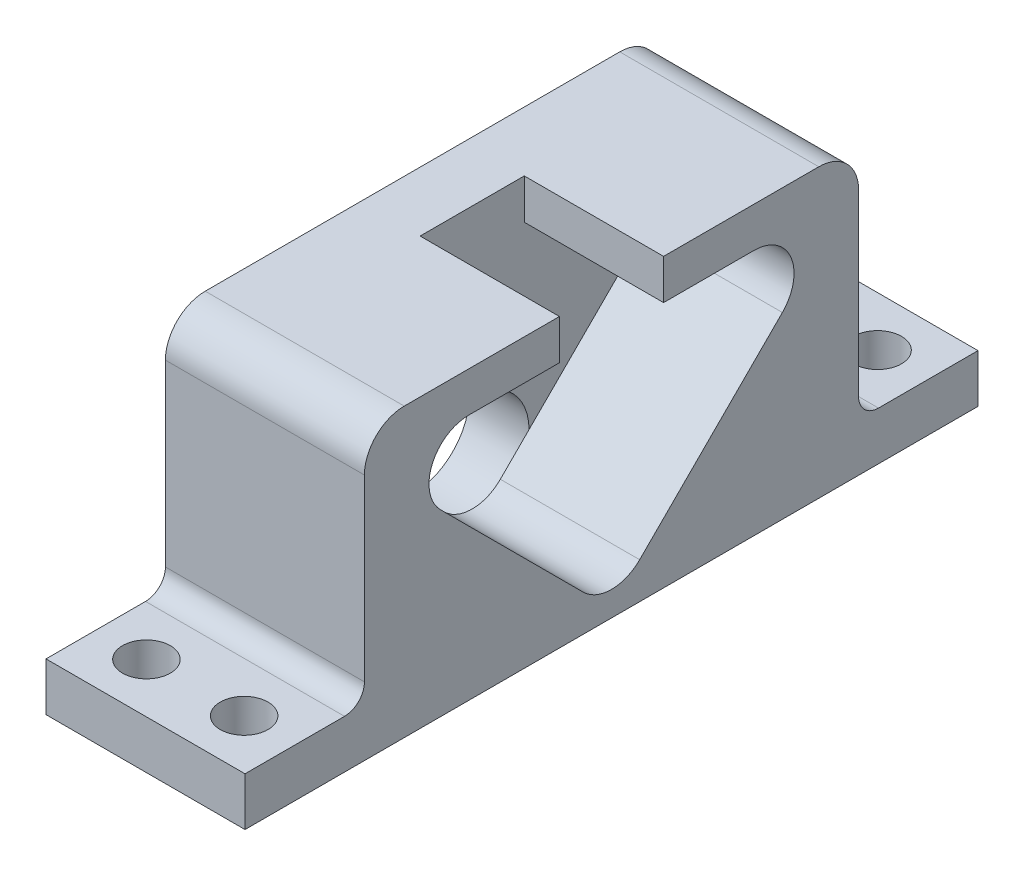
ISO-10303-21;
HEADER;
FILE_DESCRIPTION(('STEP AP214'),'2;1');
FILE_NAME('part.step','',(''),(''),'','','');
FILE_SCHEMA(('AUTOMOTIVE_DESIGN { 1 0 10303 214 1 1 1 1 }'));
ENDSEC;
DATA;
#1=APPLICATION_CONTEXT('core data for automotive mechanical design processes');
#2=APPLICATION_PROTOCOL_DEFINITION('international standard','automotive_design',2000,#1);
#3=PRODUCT_CONTEXT('',#1,'mechanical');
#4=PRODUCT('Part','Part','',(#3));
#5=PRODUCT_RELATED_PRODUCT_CATEGORY('part','',(#4));
#6=PRODUCT_DEFINITION_FORMATION('','',#4);
#7=PRODUCT_DEFINITION_CONTEXT('part definition',#1,'design');
#8=PRODUCT_DEFINITION('design','',#6,#7);
#9=PRODUCT_DEFINITION_SHAPE('','',#8);
#10=(LENGTH_UNIT() NAMED_UNIT(*) SI_UNIT(.MILLI.,.METRE.));
#11=(NAMED_UNIT(*) PLANE_ANGLE_UNIT() SI_UNIT($,.RADIAN.));
#12=(NAMED_UNIT(*) SI_UNIT($,.STERADIAN.) SOLID_ANGLE_UNIT());
#13=UNCERTAINTY_MEASURE_WITH_UNIT(LENGTH_MEASURE(1.E-05),#10,'distance_accuracy_value','');
#14=(GEOMETRIC_REPRESENTATION_CONTEXT(3) GLOBAL_UNCERTAINTY_ASSIGNED_CONTEXT((#13)) GLOBAL_UNIT_ASSIGNED_CONTEXT((#10,
#11,#12)) REPRESENTATION_CONTEXT('',''));
#15=CARTESIAN_POINT('',(0.,0.,0.));
#16=DIRECTION('',(0.,0.,1.));
#17=DIRECTION('',(1.,0.,0.));
#18=AXIS2_PLACEMENT_3D('',#15,#16,#17);
#19=CARTESIAN_POINT('',(-4.20165922888838,21.6997914847848,-15.));
#20=DIRECTION('',(0.,1.,0.));
#21=DIRECTION('',(0.,0.,1.));
#22=AXIS2_PLACEMENT_3D('',#19,#20,#21);
#23=PLANE('',#22);
#24=DIRECTION('',(0.,0.,1.));
#25=VECTOR('',#24,1.);
#26=CARTESIAN_POINT('',(-4.20165922888838,21.6997914847848,-15.));
#27=LINE('',#26,#25);
#28=CARTESIAN_POINT('',(-4.20165922888838,21.6997914847848,3.27077305544387));
#29=VERTEX_POINT('',#28);
#30=CARTESIAN_POINT('',(-4.20165922888838,21.6997914847848,8.96446609406725));
#31=VERTEX_POINT('',#30);
#32=EDGE_CURVE('E364',#29,#31,#27,.T.);
#33=ORIENTED_EDGE('',*,*,#32,.F.);
#34=DIRECTION('',(-1.,0.,0.));
#35=VECTOR('',#34,1.);
#36=CARTESIAN_POINT('',(4.54834077111162,21.6997914847848,3.27077305544387));
#37=LINE('',#36,#35);
#38=CARTESIAN_POINT('',(4.54834077111162,21.6997914847848,3.27077305544387));
#39=VERTEX_POINT('',#38);
#40=EDGE_CURVE('E380',#39,#29,#37,.T.);
#41=ORIENTED_EDGE('',*,*,#40,.F.);
#42=DIRECTION('',(0.,0.,1.));
#43=VECTOR('',#42,1.);
#44=CARTESIAN_POINT('',(4.54834077111162,21.6997914847848,-15.));
#45=LINE('',#44,#43);
#46=CARTESIAN_POINT('',(4.54834077111162,21.6997914847848,8.96446609406725));
#47=VERTEX_POINT('',#46);
#48=EDGE_CURVE('E371',#39,#47,#45,.T.);
#49=ORIENTED_EDGE('',*,*,#48,.T.);
#50=DIRECTION('',(1.,0.,0.));
#51=VECTOR('',#50,1.);
#52=CARTESIAN_POINT('',(-4.20165922888838,21.6997914847848,8.96446609406725));
#53=LINE('',#52,#51);
#54=EDGE_CURVE('E288',#47,#31,#53,.F.);
#55=ORIENTED_EDGE('',*,*,#54,.T.);
#56=EDGE_LOOP('',(#33,#41,#49,#55));
#57=FACE_BOUND('',#56,.T.);
#58=ADVANCED_FACE('F35',(#57),#23,.F.);
#59=CARTESIAN_POINT('',(4.54834077111162,9.21637163704683,-15.5177669529664));
#60=DIRECTION('',(0.,0.,1.));
#61=DIRECTION('',(0.,-1.,0.));
#62=AXIS2_PLACEMENT_3D('',#59,#60,#61);
#63=PLANE('',#62);
#64=DIRECTION('',(0.,1.,0.));
#65=VECTOR('',#64,1.);
#66=CARTESIAN_POINT('',(4.54834077111162,9.21637163704683,-15.5177669529664));
#67=LINE('',#66,#65);
#68=CARTESIAN_POINT('',(4.54834077111162,10.4663716370468,-15.5177669529664));
#69=VERTEX_POINT('',#68);
#70=CARTESIAN_POINT('',(4.54834077111162,21.7163716370468,-15.5177669529664));
#71=VERTEX_POINT('',#70);
#72=EDGE_CURVE('E225',#69,#71,#67,.T.);
#73=ORIENTED_EDGE('',*,*,#72,.F.);
#74=DIRECTION('',(-1.,0.,0.));
#75=VECTOR('',#74,1.);
#76=CARTESIAN_POINT('',(-7.95165922888838,10.4663716370468,-15.5177669529664));
#77=LINE('',#76,#75);
#78=CARTESIAN_POINT('',(-7.95165922888838,10.4663716370468,-15.5177669529664));
#79=VERTEX_POINT('',#78);
#80=EDGE_CURVE('E320',#69,#79,#77,.T.);
#81=ORIENTED_EDGE('',*,*,#80,.T.);
#82=DIRECTION('',(0.,1.,0.));
#83=VECTOR('',#82,1.);
#84=CARTESIAN_POINT('',(-7.95165922888838,9.21637163704683,-15.5177669529664));
#85=LINE('',#84,#83);
#86=CARTESIAN_POINT('',(-7.95165922888838,21.7163716370468,-15.5177669529664));
#87=VERTEX_POINT('',#86);
#88=EDGE_CURVE('E240',#79,#87,#85,.T.);
#89=ORIENTED_EDGE('',*,*,#88,.T.);
#90=DIRECTION('',(-1.,0.,0.));
#91=VECTOR('',#90,1.);
#92=CARTESIAN_POINT('',(4.54834077111162,21.7163716370468,-15.5177669529664));
#93=LINE('',#92,#91);
#94=EDGE_CURVE('E311',#87,#71,#93,.F.);
#95=ORIENTED_EDGE('',*,*,#94,.T.);
#96=EDGE_LOOP('',(#73,#81,#89,#95));
#97=FACE_BOUND('',#96,.T.);
#98=ADVANCED_FACE('F463',(#97),#63,.F.);
#99=CARTESIAN_POINT('',(4.54834077111162,24.2163716370468,-15.5177669529664));
#100=DIRECTION('',(0.,-1.,0.));
#101=DIRECTION('',(0.,0.,-1.));
#102=AXIS2_PLACEMENT_3D('',#99,#100,#101);
#103=PLANE('',#102);
#104=DIRECTION('',(0.,0.,1.));
#105=VECTOR('',#104,1.);
#106=CARTESIAN_POINT('',(4.54834077111162,24.2163716370468,-15.5177669529664));
#107=LINE('',#106,#105);
#108=CARTESIAN_POINT('',(4.54834077111162,24.2163716370468,3.27077305544387));
#109=VERTEX_POINT('',#108);
#110=CARTESIAN_POINT('',(4.54834077111162,24.2163716370468,13.0177669529664));
#111=VERTEX_POINT('',#110);
#112=EDGE_CURVE('E220',#109,#111,#107,.T.);
#113=ORIENTED_EDGE('',*,*,#112,.F.);
#114=DIRECTION('',(1.,0.,0.));
#115=VECTOR('',#114,1.);
#116=CARTESIAN_POINT('',(4.54834077111162,24.2163716370468,3.27077305544387));
#117=LINE('',#116,#115);
#118=CARTESIAN_POINT('',(-4.20165922888838,24.2163716370468,3.27077305544387));
#119=VERTEX_POINT('',#118);
#120=EDGE_CURVE('E203',#119,#109,#117,.T.);
#121=ORIENTED_EDGE('',*,*,#120,.F.);
#122=DIRECTION('',(0.,0.,1.));
#123=VECTOR('',#122,1.);
#124=CARTESIAN_POINT('',(-4.20165922888838,24.2163716370468,-3.27077305544388));
#125=LINE('',#124,#123);
#126=CARTESIAN_POINT('',(-4.20165922888838,24.2163716370468,-3.27077305544388));
#127=VERTEX_POINT('',#126);
#128=EDGE_CURVE('E213',#127,#119,#125,.T.);
#129=ORIENTED_EDGE('',*,*,#128,.F.);
#130=DIRECTION('',(-1.,0.,0.));
#131=VECTOR('',#130,1.);
#132=CARTESIAN_POINT('',(4.54834077111162,24.2163716370468,-3.27077305544388));
#133=LINE('',#132,#131);
#134=CARTESIAN_POINT('',(4.54834077111162,24.2163716370468,-3.27077305544388));
#135=VERTEX_POINT('',#134);
#136=EDGE_CURVE('E194',#135,#127,#133,.T.);
#137=ORIENTED_EDGE('',*,*,#136,.F.);
#138=CARTESIAN_POINT('',(4.54834077111162,24.2163716370468,-13.0177669529664));
#139=VERTEX_POINT('',#138);
#140=EDGE_CURVE('E210',#139,#135,#107,.T.);
#141=ORIENTED_EDGE('',*,*,#140,.F.);
#142=DIRECTION('',(-1.,0.,0.));
#143=VECTOR('',#142,1.);
#144=CARTESIAN_POINT('',(4.54834077111162,24.2163716370468,-13.0177669529664));
#145=LINE('',#144,#143);
#146=CARTESIAN_POINT('',(-7.95165922888838,24.2163716370468,-13.0177669529664));
#147=VERTEX_POINT('',#146);
#148=EDGE_CURVE('E304',#139,#147,#145,.T.);
#149=ORIENTED_EDGE('',*,*,#148,.T.);
#150=DIRECTION('',(0.,0.,1.));
#151=VECTOR('',#150,1.);
#152=CARTESIAN_POINT('',(-7.95165922888838,24.2163716370468,-15.5177669529664));
#153=LINE('',#152,#151);
#154=CARTESIAN_POINT('',(-7.95165922888838,24.2163716370468,13.0177669529664));
#155=VERTEX_POINT('',#154);
#156=EDGE_CURVE('E242',#147,#155,#153,.T.);
#157=ORIENTED_EDGE('',*,*,#156,.T.);
#158=DIRECTION('',(-1.,0.,0.));
#159=VECTOR('',#158,1.);
#160=CARTESIAN_POINT('',(4.54834077111162,24.2163716370468,13.0177669529664));
#161=LINE('',#160,#159);
#162=EDGE_CURVE('E301',#155,#111,#161,.F.);
#163=ORIENTED_EDGE('',*,*,#162,.T.);
#164=EDGE_LOOP('',(#113,#121,#129,#137,#141,#149,#157,#163));
#165=FACE_BOUND('',#164,.T.);
#166=ADVANCED_FACE('F208',(#165),#103,.F.);
#167=CARTESIAN_POINT('',(4.54834077111162,24.2163716370468,15.5177669529664));
#168=DIRECTION('',(0.,0.,-1.));
#169=DIRECTION('',(-1.,0.,0.));
#170=AXIS2_PLACEMENT_3D('',#167,#168,#169);
#171=PLANE('',#170);
#172=DIRECTION('',(0.,-1.,0.));
#173=VECTOR('',#172,1.);
#174=CARTESIAN_POINT('',(-7.95165922888838,24.2163716370468,15.5177669529664));
#175=LINE('',#174,#173);
#176=CARTESIAN_POINT('',(-7.95165922888838,21.7163716370468,15.5177669529664));
#177=VERTEX_POINT('',#176);
#178=CARTESIAN_POINT('',(-7.95165922888838,10.4663716370468,15.5177669529664));
#179=VERTEX_POINT('',#178);
#180=EDGE_CURVE('E246',#177,#179,#175,.T.);
#181=ORIENTED_EDGE('',*,*,#180,.T.);
#182=DIRECTION('',(-1.,0.,0.));
#183=VECTOR('',#182,1.);
#184=CARTESIAN_POINT('',(4.54834077111162,10.4663716370468,15.5177669529664));
#185=LINE('',#184,#183);
#186=CARTESIAN_POINT('',(4.54834077111162,10.4663716370468,15.5177669529664));
#187=VERTEX_POINT('',#186);
#188=EDGE_CURVE('E328',#179,#187,#185,.F.);
#189=ORIENTED_EDGE('',*,*,#188,.T.);
#190=DIRECTION('',(0.,-1.,0.));
#191=VECTOR('',#190,1.);
#192=CARTESIAN_POINT('',(4.54834077111162,24.2163716370468,15.5177669529664));
#193=LINE('',#192,#191);
#194=CARTESIAN_POINT('',(4.54834077111162,21.7163716370468,15.5177669529664));
#195=VERTEX_POINT('',#194);
#196=EDGE_CURVE('E219',#195,#187,#193,.T.);
#197=ORIENTED_EDGE('',*,*,#196,.F.);
#198=DIRECTION('',(-1.,0.,0.));
#199=VECTOR('',#198,1.);
#200=CARTESIAN_POINT('',(4.54834077111162,21.7163716370468,15.5177669529664));
#201=LINE('',#200,#199);
#202=EDGE_CURVE('E317',#195,#177,#201,.T.);
#203=ORIENTED_EDGE('',*,*,#202,.T.);
#204=EDGE_LOOP('',(#181,#189,#197,#203));
#205=FACE_BOUND('',#204,.T.);
#206=ADVANCED_FACE('F437',(#205),#171,.F.);
#207=CARTESIAN_POINT('',(4.54834077111162,9.21637163704683,15.5177669529664));
#208=DIRECTION('',(0.,-1.,0.));
#209=DIRECTION('',(0.,0.,-1.));
#210=AXIS2_PLACEMENT_3D('',#207,#208,#209);
#211=PLANE('',#210);
#212=CARTESIAN_POINT('',(1.36662188836983,9.21637163704683,19.8927669529664));
#213=DIRECTION('',(0.,1.,0.));
#214=DIRECTION('',(0.,0.,-1.));
#215=AXIS2_PLACEMENT_3D('',#212,#213,#214);
#216=CIRCLE('',#215,1.5);
#217=CARTESIAN_POINT('',(1.36662188836983,9.21637163704683,18.3927669529664));
#218=VERTEX_POINT('',#217);
#219=EDGE_CURVE('E347',#218,#218,#216,.T.);
#220=ORIENTED_EDGE('',*,*,#219,.F.);
#221=EDGE_LOOP('',(#220));
#222=FACE_BOUND('',#221,.T.);
#223=CARTESIAN_POINT('',(-4.76994034614659,9.21637163704683,19.8927669529664));
#224=DIRECTION('',(0.,1.,0.));
#225=DIRECTION('',(0.,0.,1.));
#226=AXIS2_PLACEMENT_3D('',#223,#224,#225);
#227=CIRCLE('',#226,1.5);
#228=CARTESIAN_POINT('',(-4.76994034614659,9.21637163704683,21.3927669529664));
#229=VERTEX_POINT('',#228);
#230=EDGE_CURVE('E337',#229,#229,#227,.T.);
#231=ORIENTED_EDGE('',*,*,#230,.F.);
#232=EDGE_LOOP('',(#231));
#233=FACE_BOUND('',#232,.T.);
#234=DIRECTION('',(0.,0.,1.));
#235=VECTOR('',#234,1.);
#236=CARTESIAN_POINT('',(4.54834077111162,9.21637163704683,15.5177669529664));
#237=LINE('',#236,#235);
#238=CARTESIAN_POINT('',(4.54834077111162,9.21637163704683,16.7677669529664));
#239=VERTEX_POINT('',#238);
#240=CARTESIAN_POINT('',(4.54834077111162,9.21637163704683,23.0177669529664));
#241=VERTEX_POINT('',#240);
#242=EDGE_CURVE('E223',#239,#241,#237,.T.);
#243=ORIENTED_EDGE('',*,*,#242,.F.);
#244=DIRECTION('',(-1.,0.,0.));
#245=VECTOR('',#244,1.);
#246=CARTESIAN_POINT('',(-7.95165922888838,9.21637163704683,16.7677669529664));
#247=LINE('',#246,#245);
#248=CARTESIAN_POINT('',(-7.95165922888838,9.21637163704683,16.7677669529664));
#249=VERTEX_POINT('',#248);
#250=EDGE_CURVE('E325',#239,#249,#247,.T.);
#251=ORIENTED_EDGE('',*,*,#250,.T.);
#252=DIRECTION('',(0.,0.,1.));
#253=VECTOR('',#252,1.);
#254=CARTESIAN_POINT('',(-7.95165922888838,9.21637163704683,15.5177669529664));
#255=LINE('',#254,#253);
#256=CARTESIAN_POINT('',(-7.95165922888838,9.21637163704683,23.0177669529664));
#257=VERTEX_POINT('',#256);
#258=EDGE_CURVE('E248',#249,#257,#255,.T.);
#259=ORIENTED_EDGE('',*,*,#258,.T.);
#260=DIRECTION('',(-1.,0.,0.));
#261=VECTOR('',#260,1.);
#262=CARTESIAN_POINT('',(4.54834077111162,9.21637163704683,23.0177669529664));
#263=LINE('',#262,#261);
#264=EDGE_CURVE('E267',#241,#257,#263,.T.);
#265=ORIENTED_EDGE('',*,*,#264,.F.);
#266=EDGE_LOOP('',(#243,#251,#259,#265));
#267=FACE_BOUND('',#266,.T.);
#268=ADVANCED_FACE('F433',(#222,#233,#267),#211,.F.);
#269=CARTESIAN_POINT('',(4.54834077111162,9.21637163704683,23.0177669529664));
#270=DIRECTION('',(0.,0.,-1.));
#271=DIRECTION('',(-1.,0.,0.));
#272=AXIS2_PLACEMENT_3D('',#269,#270,#271);
#273=PLANE('',#272);
#274=DIRECTION('',(0.,-1.,0.));
#275=VECTOR('',#274,1.);
#276=CARTESIAN_POINT('',(-7.95165922888838,9.21637163704683,23.0177669529664));
#277=LINE('',#276,#275);
#278=CARTESIAN_POINT('',(-7.95165922888838,6.18231268137411,23.0177669529664));
#279=VERTEX_POINT('',#278);
#280=EDGE_CURVE('E250',#257,#279,#277,.T.);
#281=ORIENTED_EDGE('',*,*,#280,.T.);
#282=DIRECTION('',(-1.,0.,0.));
#283=VECTOR('',#282,1.);
#284=CARTESIAN_POINT('',(4.54834077111162,6.18231268137411,23.0177669529664));
#285=LINE('',#284,#283);
#286=CARTESIAN_POINT('',(4.54834077111162,6.18231268137411,23.0177669529664));
#287=VERTEX_POINT('',#286);
#288=EDGE_CURVE('E264',#287,#279,#285,.T.);
#289=ORIENTED_EDGE('',*,*,#288,.F.);
#290=DIRECTION('',(0.,-1.,0.));
#291=VECTOR('',#290,1.);
#292=CARTESIAN_POINT('',(4.54834077111162,9.21637163704683,23.0177669529664));
#293=LINE('',#292,#291);
#294=EDGE_CURVE('E230',#241,#287,#293,.T.);
#295=ORIENTED_EDGE('',*,*,#294,.F.);
#296=ORIENTED_EDGE('',*,*,#264,.T.);
#297=EDGE_LOOP('',(#281,#289,#295,#296));
#298=FACE_BOUND('',#297,.T.);
#299=ADVANCED_FACE('F436',(#298),#273,.F.);
#300=CARTESIAN_POINT('',(4.54834077111162,6.18231268137411,23.0177669529664));
#301=DIRECTION('',(0.,1.,0.));
#302=DIRECTION('',(0.,0.,1.));
#303=AXIS2_PLACEMENT_3D('',#300,#301,#302);
#304=PLANE('',#303);
#305=CARTESIAN_POINT('',(1.36662188836983,6.18231268137411,-19.8927669529664));
#306=DIRECTION('',(0.,1.,0.));
#307=DIRECTION('',(0.,0.,1.));
#308=AXIS2_PLACEMENT_3D('',#305,#306,#307);
#309=CIRCLE('',#308,1.5);
#310=CARTESIAN_POINT('',(1.36662188836983,6.18231268137411,-18.3927669529664));
#311=VERTEX_POINT('',#310);
#312=EDGE_CURVE('E413',#311,#311,#309,.F.);
#313=ORIENTED_EDGE('',*,*,#312,.F.);
#314=EDGE_LOOP('',(#313));
#315=FACE_BOUND('',#314,.T.);
#316=CARTESIAN_POINT('',(-4.76994034614659,6.18231268137411,-19.8927669529664));
#317=DIRECTION('',(0.,1.,0.));
#318=DIRECTION('',(0.,0.,1.));
#319=AXIS2_PLACEMENT_3D('',#316,#317,#318);
#320=CIRCLE('',#319,1.5);
#321=CARTESIAN_POINT('',(-4.76994034614659,6.18231268137411,-18.3927669529664));
#322=VERTEX_POINT('',#321);
#323=EDGE_CURVE('E423',#322,#322,#320,.F.);
#324=ORIENTED_EDGE('',*,*,#323,.F.);
#325=EDGE_LOOP('',(#324));
#326=FACE_BOUND('',#325,.T.);
#327=CARTESIAN_POINT('',(1.36662188836983,6.18231268137411,19.8927669529664));
#328=DIRECTION('',(0.,1.,0.));
#329=DIRECTION('',(0.,0.,1.));
#330=AXIS2_PLACEMENT_3D('',#327,#328,#329);
#331=CIRCLE('',#330,1.5);
#332=CARTESIAN_POINT('',(1.36662188836983,6.18231268137411,21.3927669529664));
#333=VERTEX_POINT('',#332);
#334=EDGE_CURVE('E39',#333,#333,#331,.T.);
#335=ORIENTED_EDGE('',*,*,#334,.T.);
#336=EDGE_LOOP('',(#335));
#337=FACE_BOUND('',#336,.T.);
#338=CARTESIAN_POINT('',(-4.76994034614659,6.18231268137411,19.8927669529664));
#339=DIRECTION('',(0.,1.,0.));
#340=DIRECTION('',(0.,0.,1.));
#341=AXIS2_PLACEMENT_3D('',#338,#339,#340);
#342=CIRCLE('',#341,1.5);
#343=CARTESIAN_POINT('',(-4.76994034614659,6.18231268137411,21.3927669529664));
#344=VERTEX_POINT('',#343);
#345=EDGE_CURVE('E334',#344,#344,#342,.T.);
#346=ORIENTED_EDGE('',*,*,#345,.T.);
#347=EDGE_LOOP('',(#346));
#348=FACE_BOUND('',#347,.T.);
#349=DIRECTION('',(0.,0.,-1.));
#350=VECTOR('',#349,1.);
#351=CARTESIAN_POINT('',(-7.95165922888838,6.18231268137411,23.0177669529664));
#352=LINE('',#351,#350);
#353=CARTESIAN_POINT('',(-7.95165922888838,6.18231268137411,-23.0177669529664));
#354=VERTEX_POINT('',#353);
#355=EDGE_CURVE('E252',#279,#354,#352,.T.);
#356=ORIENTED_EDGE('',*,*,#355,.T.);
#357=DIRECTION('',(-1.,0.,0.));
#358=VECTOR('',#357,1.);
#359=CARTESIAN_POINT('',(4.54834077111162,6.18231268137411,-23.0177669529664));
#360=LINE('',#359,#358);
#361=CARTESIAN_POINT('',(4.54834077111162,6.18231268137411,-23.0177669529664));
#362=VERTEX_POINT('',#361);
#363=EDGE_CURVE('E261',#362,#354,#360,.T.);
#364=ORIENTED_EDGE('',*,*,#363,.F.);
#365=DIRECTION('',(0.,0.,-1.));
#366=VECTOR('',#365,1.);
#367=CARTESIAN_POINT('',(4.54834077111162,6.18231268137411,23.0177669529664));
#368=LINE('',#367,#366);
#369=EDGE_CURVE('E232',#287,#362,#368,.T.);
#370=ORIENTED_EDGE('',*,*,#369,.F.);
#371=ORIENTED_EDGE('',*,*,#288,.T.);
#372=EDGE_LOOP('',(#356,#364,#370,#371));
#373=FACE_BOUND('',#372,.T.);
#374=ADVANCED_FACE('F482',(#315,#326,#337,#348,#373),#304,.F.);
#375=CARTESIAN_POINT('',(4.54834077111162,6.18231268137411,-23.0177669529664));
#376=DIRECTION('',(0.,0.,1.));
#377=DIRECTION('',(0.,-1.,0.));
#378=AXIS2_PLACEMENT_3D('',#375,#376,#377);
#379=PLANE('',#378);
#380=DIRECTION('',(0.,1.,0.));
#381=VECTOR('',#380,1.);
#382=CARTESIAN_POINT('',(-7.95165922888838,6.18231268137411,-23.0177669529664));
#383=LINE('',#382,#381);
#384=CARTESIAN_POINT('',(-7.95165922888838,9.21637163704683,-23.0177669529664));
#385=VERTEX_POINT('',#384);
#386=EDGE_CURVE('E254',#354,#385,#383,.T.);
#387=ORIENTED_EDGE('',*,*,#386,.T.);
#388=DIRECTION('',(-1.,0.,0.));
#389=VECTOR('',#388,1.);
#390=CARTESIAN_POINT('',(4.54834077111162,9.21637163704683,-23.0177669529664));
#391=LINE('',#390,#389);
#392=CARTESIAN_POINT('',(4.54834077111162,9.21637163704683,-23.0177669529664));
#393=VERTEX_POINT('',#392);
#394=EDGE_CURVE('E239',#393,#385,#391,.T.);
#395=ORIENTED_EDGE('',*,*,#394,.F.);
#396=DIRECTION('',(0.,1.,0.));
#397=VECTOR('',#396,1.);
#398=CARTESIAN_POINT('',(4.54834077111162,6.18231268137411,-23.0177669529664));
#399=LINE('',#398,#397);
#400=EDGE_CURVE('E234',#362,#393,#399,.T.);
#401=ORIENTED_EDGE('',*,*,#400,.F.);
#402=ORIENTED_EDGE('',*,*,#363,.T.);
#403=EDGE_LOOP('',(#387,#395,#401,#402));
#404=FACE_BOUND('',#403,.T.);
#405=ADVANCED_FACE('F477',(#404),#379,.F.);
#406=CARTESIAN_POINT('',(4.54834077111162,9.21637163704683,-23.0177669529664));
#407=DIRECTION('',(0.,-1.,0.));
#408=DIRECTION('',(0.,0.,-1.));
#409=AXIS2_PLACEMENT_3D('',#406,#407,#408);
#410=PLANE('',#409);
#411=CARTESIAN_POINT('',(1.36662188836983,9.21637163704683,-19.8927669529664));
#412=DIRECTION('',(0.,-1.,0.));
#413=DIRECTION('',(0.,0.,1.));
#414=AXIS2_PLACEMENT_3D('',#411,#412,#413);
#415=CIRCLE('',#414,1.5);
#416=CARTESIAN_POINT('',(1.36662188836983,9.21637163704683,-18.3927669529664));
#417=VERTEX_POINT('',#416);
#418=EDGE_CURVE('E410',#417,#417,#415,.T.);
#419=ORIENTED_EDGE('',*,*,#418,.T.);
#420=EDGE_LOOP('',(#419));
#421=FACE_BOUND('',#420,.T.);
#422=CARTESIAN_POINT('',(-4.76994034614659,9.21637163704683,-19.8927669529664));
#423=DIRECTION('',(0.,-1.,0.));
#424=DIRECTION('',(0.,0.,-1.));
#425=AXIS2_PLACEMENT_3D('',#422,#423,#424);
#426=CIRCLE('',#425,1.5);
#427=CARTESIAN_POINT('',(-4.76994034614659,9.21637163704683,-21.3927669529664));
#428=VERTEX_POINT('',#427);
#429=EDGE_CURVE('E421',#428,#428,#426,.T.);
#430=ORIENTED_EDGE('',*,*,#429,.T.);
#431=EDGE_LOOP('',(#430));
#432=FACE_BOUND('',#431,.T.);
#433=DIRECTION('',(0.,0.,1.));
#434=VECTOR('',#433,1.);
#435=CARTESIAN_POINT('',(-7.95165922888838,9.21637163704683,-23.0177669529664));
#436=LINE('',#435,#434);
#437=CARTESIAN_POINT('',(-7.95165922888838,9.21637163704683,-16.7677669529664));
#438=VERTEX_POINT('',#437);
#439=EDGE_CURVE('E256',#385,#438,#436,.T.);
#440=ORIENTED_EDGE('',*,*,#439,.T.);
#441=DIRECTION('',(-1.,0.,0.));
#442=VECTOR('',#441,1.);
#443=CARTESIAN_POINT('',(4.54834077111162,9.21637163704683,-16.7677669529664));
#444=LINE('',#443,#442);
#445=CARTESIAN_POINT('',(4.54834077111162,9.21637163704683,-16.7677669529664));
#446=VERTEX_POINT('',#445);
#447=EDGE_CURVE('E323',#438,#446,#444,.F.);
#448=ORIENTED_EDGE('',*,*,#447,.T.);
#449=DIRECTION('',(0.,0.,1.));
#450=VECTOR('',#449,1.);
#451=CARTESIAN_POINT('',(4.54834077111162,9.21637163704683,-23.0177669529664));
#452=LINE('',#451,#450);
#453=EDGE_CURVE('E236',#393,#446,#452,.T.);
#454=ORIENTED_EDGE('',*,*,#453,.F.);
#455=ORIENTED_EDGE('',*,*,#394,.T.);
#456=EDGE_LOOP('',(#440,#448,#454,#455));
#457=FACE_BOUND('',#456,.T.);
#458=ADVANCED_FACE('F471',(#421,#432,#457),#410,.F.);
#459=CARTESIAN_POINT('',(4.54834077111162,10.4663716370468,0.));
#460=DIRECTION('',(1.,0.,0.));
#461=DIRECTION('',(0.,0.,-1.));
#462=AXIS2_PLACEMENT_3D('',#459,#460,#461);
#463=PLANE('',#462);
#464=DIRECTION('',(0.,1.,0.));
#465=VECTOR('',#464,1.);
#466=CARTESIAN_POINT('',(4.54834077111162,10.7748509576757,3.27077305544387));
#467=LINE('',#466,#465);
#468=EDGE_CURVE('E415',#39,#109,#467,.T.);
#469=ORIENTED_EDGE('',*,*,#468,.T.);
#470=ORIENTED_EDGE('',*,*,#112,.T.);
#471=CARTESIAN_POINT('',(4.54834077111162,21.7163716370468,13.0177669529664));
#472=DIRECTION('',(1.,0.,0.));
#473=DIRECTION('',(0.,0.,-1.));
#474=AXIS2_PLACEMENT_3D('',#471,#472,#473);
#475=CIRCLE('',#474,2.5);
#476=EDGE_CURVE('E314',#111,#195,#475,.T.);
#477=ORIENTED_EDGE('',*,*,#476,.T.);
#478=ORIENTED_EDGE('',*,*,#196,.T.);
#479=CARTESIAN_POINT('',(4.54834077111162,10.4663716370468,16.7677669529664));
#480=DIRECTION('',(1.,0.,0.));
#481=DIRECTION('',(0.,0.,-1.));
#482=AXIS2_PLACEMENT_3D('',#479,#480,#481);
#483=CIRCLE('',#482,1.25);
#484=EDGE_CURVE('E11',#187,#239,#483,.F.);
#485=ORIENTED_EDGE('',*,*,#484,.T.);
#486=ORIENTED_EDGE('',*,*,#242,.T.);
#487=ORIENTED_EDGE('',*,*,#294,.T.);
#488=ORIENTED_EDGE('',*,*,#369,.T.);
#489=ORIENTED_EDGE('',*,*,#400,.T.);
#490=ORIENTED_EDGE('',*,*,#453,.T.);
#491=CARTESIAN_POINT('',(4.54834077111162,10.4663716370468,-16.7677669529664));
#492=DIRECTION('',(1.,0.,0.));
#493=DIRECTION('',(0.,0.,-1.));
#494=AXIS2_PLACEMENT_3D('',#491,#492,#493);
#495=CIRCLE('',#494,1.25);
#496=EDGE_CURVE('E332',#446,#69,#495,.F.);
#497=ORIENTED_EDGE('',*,*,#496,.T.);
#498=ORIENTED_EDGE('',*,*,#72,.T.);
#499=CARTESIAN_POINT('',(4.54834077111162,21.7163716370468,-13.0177669529664));
#500=DIRECTION('',(1.,0.,0.));
#501=DIRECTION('',(0.,0.,-1.));
#502=AXIS2_PLACEMENT_3D('',#499,#500,#501);
#503=CIRCLE('',#502,2.5);
#504=EDGE_CURVE('E218',#71,#139,#503,.T.);
#505=ORIENTED_EDGE('',*,*,#504,.T.);
#506=ORIENTED_EDGE('',*,*,#140,.T.);
#507=DIRECTION('',(0.,1.,0.));
#508=VECTOR('',#507,1.);
#509=CARTESIAN_POINT('',(4.54834077111162,10.7748509576757,-3.27077305544388));
#510=LINE('',#509,#508);
#511=CARTESIAN_POINT('',(4.54834077111162,21.6997914847848,-3.27077305544388));
#512=VERTEX_POINT('',#511);
#513=EDGE_CURVE('E191',#512,#135,#510,.T.);
#514=ORIENTED_EDGE('',*,*,#513,.F.);
#515=CARTESIAN_POINT('',(4.54834077111162,21.6997914847848,-8.96446609406727));
#516=VERTEX_POINT('',#515);
#517=EDGE_CURVE('E372',#516,#512,#45,.T.);
#518=ORIENTED_EDGE('',*,*,#517,.F.);
#519=CARTESIAN_POINT('',(4.54834077111162,19.1997914847848,-8.96446609406727));
#520=DIRECTION('',(1.,0.,0.));
#521=DIRECTION('',(0.,0.,-1.));
#522=AXIS2_PLACEMENT_3D('',#519,#520,#521);
#523=CIRCLE('',#522,2.5);
#524=CARTESIAN_POINT('',(4.54834077111162,17.4320245318184,-10.7322330470336));
#525=VERTEX_POINT('',#524);
#526=EDGE_CURVE('E296',#516,#525,#523,.F.);
#527=ORIENTED_EDGE('',*,*,#526,.T.);
#528=DIRECTION('',(0.,0.707106781186547,-0.707106781186547));
#529=VECTOR('',#528,1.);
#530=CARTESIAN_POINT('',(4.54834077111162,6.69979148478482,0.));
#531=LINE('',#530,#529);
#532=CARTESIAN_POINT('',(4.54834077111162,8.46755843775118,-1.76776695296638));
#533=VERTEX_POINT('',#532);
#534=EDGE_CURVE('E369',#533,#525,#531,.T.);
#535=ORIENTED_EDGE('',*,*,#534,.F.);
#536=CARTESIAN_POINT('',(4.54834077111162,10.2353253907176,0.));
#537=DIRECTION('',(1.,0.,0.));
#538=DIRECTION('',(0.,0.,-1.));
#539=AXIS2_PLACEMENT_3D('',#536,#537,#538);
#540=CIRCLE('',#539,2.5);
#541=CARTESIAN_POINT('',(4.54834077111162,8.46755843775119,1.76776695296637));
#542=VERTEX_POINT('',#541);
#543=EDGE_CURVE('E294',#533,#542,#540,.F.);
#544=ORIENTED_EDGE('',*,*,#543,.T.);
#545=DIRECTION('',(0.,-0.707106781186547,-0.707106781186547));
#546=VECTOR('',#545,1.);
#547=CARTESIAN_POINT('',(4.54834077111162,21.6997914847848,15.));
#548=LINE('',#547,#546);
#549=CARTESIAN_POINT('',(4.54834077111162,17.4320245318184,10.7322330470336));
#550=VERTEX_POINT('',#549);
#551=EDGE_CURVE('E355',#550,#542,#548,.T.);
#552=ORIENTED_EDGE('',*,*,#551,.F.);
#553=CARTESIAN_POINT('',(4.54834077111162,19.1997914847848,8.96446609406725));
#554=DIRECTION('',(1.,0.,0.));
#555=DIRECTION('',(0.,0.,-1.));
#556=AXIS2_PLACEMENT_3D('',#553,#554,#555);
#557=CIRCLE('',#556,2.5);
#558=EDGE_CURVE('E298',#550,#47,#557,.F.);
#559=ORIENTED_EDGE('',*,*,#558,.T.);
#560=ORIENTED_EDGE('',*,*,#48,.F.);
#561=EDGE_LOOP('',(#469,#470,#477,#478,#485,#486,#487,#488,#489,#490,#497,#498,#505,#506,#514,
#518,#527,#535,#544,#552,#559,#560));
#562=FACE_BOUND('',#561,.T.);
#563=ADVANCED_FACE('F216',(#562),#463,.T.);
#564=CARTESIAN_POINT('',(-7.95165922888838,10.4663716370468,0.));
#565=DIRECTION('',(1.,0.,0.));
#566=DIRECTION('',(0.,0.,-1.));
#567=AXIS2_PLACEMENT_3D('',#564,#565,#566);
#568=PLANE('',#567);
#569=CARTESIAN_POINT('',(-7.95165922888838,10.2353253907176,0.));
#570=DIRECTION('',(1.,0.,0.));
#571=DIRECTION('',(0.,0.,-1.));
#572=AXIS2_PLACEMENT_3D('',#569,#570,#571);
#573=CIRCLE('',#572,3.57369917320052);
#574=CARTESIAN_POINT('',(-7.95165922888838,10.2353253907176,-3.57369917320053));
#575=VERTEX_POINT('',#574);
#576=EDGE_CURVE('E352',#575,#575,#573,.F.);
#577=ORIENTED_EDGE('',*,*,#576,.F.);
#578=EDGE_LOOP('',(#577));
#579=FACE_BOUND('',#578,.T.);
#580=ORIENTED_EDGE('',*,*,#156,.F.);
#581=CARTESIAN_POINT('',(-7.95165922888838,21.7163716370468,-13.0177669529664));
#582=DIRECTION('',(1.,0.,0.));
#583=DIRECTION('',(0.,0.,-1.));
#584=AXIS2_PLACEMENT_3D('',#581,#582,#583);
#585=CIRCLE('',#584,2.5);
#586=EDGE_CURVE('E308',#147,#87,#585,.F.);
#587=ORIENTED_EDGE('',*,*,#586,.T.);
#588=ORIENTED_EDGE('',*,*,#88,.F.);
#589=CARTESIAN_POINT('',(-7.95165922888838,10.4663716370468,-16.7677669529664));
#590=DIRECTION('',(1.,0.,0.));
#591=DIRECTION('',(0.,0.,-1.));
#592=AXIS2_PLACEMENT_3D('',#589,#590,#591);
#593=CIRCLE('',#592,1.25);
#594=EDGE_CURVE('E330',#79,#438,#593,.T.);
#595=ORIENTED_EDGE('',*,*,#594,.T.);
#596=ORIENTED_EDGE('',*,*,#439,.F.);
#597=ORIENTED_EDGE('',*,*,#386,.F.);
#598=ORIENTED_EDGE('',*,*,#355,.F.);
#599=ORIENTED_EDGE('',*,*,#280,.F.);
#600=ORIENTED_EDGE('',*,*,#258,.F.);
#601=CARTESIAN_POINT('',(-7.95165922888838,10.4663716370468,16.7677669529664));
#602=DIRECTION('',(1.,0.,0.));
#603=DIRECTION('',(0.,0.,-1.));
#604=AXIS2_PLACEMENT_3D('',#601,#602,#603);
#605=CIRCLE('',#604,1.25);
#606=EDGE_CURVE('E44',#249,#179,#605,.T.);
#607=ORIENTED_EDGE('',*,*,#606,.T.);
#608=ORIENTED_EDGE('',*,*,#180,.F.);
#609=CARTESIAN_POINT('',(-7.95165922888838,21.7163716370468,13.0177669529664));
#610=DIRECTION('',(1.,0.,0.));
#611=DIRECTION('',(0.,0.,-1.));
#612=AXIS2_PLACEMENT_3D('',#609,#610,#611);
#613=CIRCLE('',#612,2.5);
#614=EDGE_CURVE('E306',#177,#155,#613,.F.);
#615=ORIENTED_EDGE('',*,*,#614,.T.);
#616=EDGE_LOOP('',(#580,#587,#588,#595,#596,#597,#598,#599,#600,#607,#608,#615));
#617=FACE_BOUND('',#616,.T.);
#618=ADVANCED_FACE('F455',(#579,#617),#568,.F.);
#619=CARTESIAN_POINT('',(-4.20165922888838,21.6997914847848,15.));
#620=DIRECTION('',(0.,-0.707106781186548,0.707106781186548));
#621=DIRECTION('',(0.,-0.707106781186548,-0.707106781186548));
#622=AXIS2_PLACEMENT_3D('',#619,#620,#621);
#623=PLANE('',#622);
#624=ORIENTED_EDGE('',*,*,#551,.T.);
#625=DIRECTION('',(1.,0.,0.));
#626=VECTOR('',#625,1.);
#627=CARTESIAN_POINT('',(-4.20165922888838,8.46755843775119,1.76776695296636));
#628=LINE('',#627,#626);
#629=CARTESIAN_POINT('',(-4.20165922888838,8.46755843775119,1.76776695296637));
#630=VERTEX_POINT('',#629);
#631=EDGE_CURVE('E279',#542,#630,#628,.F.);
#632=ORIENTED_EDGE('',*,*,#631,.T.);
#633=DIRECTION('',(0.,-0.707106781186547,-0.707106781186547));
#634=VECTOR('',#633,1.);
#635=CARTESIAN_POINT('',(-4.20165922888838,21.6997914847848,15.));
#636=LINE('',#635,#634);
#637=CARTESIAN_POINT('',(-4.20165922888838,10.2732890074285,3.57349752264364));
#638=VERTEX_POINT('',#637);
#639=EDGE_CURVE('E360',#638,#630,#636,.T.);
#640=ORIENTED_EDGE('',*,*,#639,.F.);
#641=CARTESIAN_POINT('',(-4.20165922888838,17.4320245318184,10.7322330470336));
#642=VERTEX_POINT('',#641);
#643=EDGE_CURVE('E356',#642,#638,#636,.T.);
#644=ORIENTED_EDGE('',*,*,#643,.F.);
#645=DIRECTION('',(1.,0.,0.));
#646=VECTOR('',#645,1.);
#647=CARTESIAN_POINT('',(4.54834077111162,17.4320245318184,10.7322330470336));
#648=LINE('',#647,#646);
#649=EDGE_CURVE('E276',#642,#550,#648,.T.);
#650=ORIENTED_EDGE('',*,*,#649,.T.);
#651=EDGE_LOOP('',(#624,#632,#640,#644,#650));
#652=FACE_BOUND('',#651,.T.);
#653=ADVANCED_FACE('F390',(#652),#623,.F.);
#654=ORIENTED_EDGE('',*,*,#517,.T.);
#655=DIRECTION('',(1.,0.,0.));
#656=VECTOR('',#655,1.);
#657=CARTESIAN_POINT('',(4.54834077111162,21.6997914847848,-3.27077305544388));
#658=LINE('',#657,#656);
#659=CARTESIAN_POINT('',(-4.20165922888838,21.6997914847848,-3.27077305544388));
#660=VERTEX_POINT('',#659);
#661=EDGE_CURVE('E197',#660,#512,#658,.T.);
#662=ORIENTED_EDGE('',*,*,#661,.F.);
#663=CARTESIAN_POINT('',(-4.20165922888838,21.6997914847848,-8.96446609406727));
#664=VERTEX_POINT('',#663);
#665=EDGE_CURVE('E243',#664,#660,#27,.T.);
#666=ORIENTED_EDGE('',*,*,#665,.F.);
#667=DIRECTION('',(1.,0.,0.));
#668=VECTOR('',#667,1.);
#669=CARTESIAN_POINT('',(4.54834077111162,21.6997914847848,-8.96446609406727));
#670=LINE('',#669,#668);
#671=EDGE_CURVE('E291',#664,#516,#670,.T.);
#672=ORIENTED_EDGE('',*,*,#671,.T.);
#673=EDGE_LOOP('',(#654,#662,#666,#672));
#674=FACE_BOUND('',#673,.T.);
#675=ADVANCED_FACE('F409',(#674),#23,.F.);
#676=CARTESIAN_POINT('',(-4.20165922888838,6.69979148478482,0.));
#677=DIRECTION('',(0.,-0.707106781186548,-0.707106781186548));
#678=DIRECTION('',(0.,0.707106781186548,-0.707106781186548));
#679=AXIS2_PLACEMENT_3D('',#676,#677,#678);
#680=PLANE('',#679);
#681=DIRECTION('',(0.,0.707106781186547,-0.707106781186547));
#682=VECTOR('',#681,1.);
#683=CARTESIAN_POINT('',(-4.20165922888838,6.69979148478482,0.));
#684=LINE('',#683,#682);
#685=CARTESIAN_POINT('',(-4.20165922888838,8.46755843775118,-1.76776695296638));
#686=VERTEX_POINT('',#685);
#687=CARTESIAN_POINT('',(-4.20165922888838,10.2732890074285,-3.57349752264366));
#688=VERTEX_POINT('',#687);
#689=EDGE_CURVE('E361',#686,#688,#684,.T.);
#690=ORIENTED_EDGE('',*,*,#689,.F.);
#691=DIRECTION('',(1.,0.,0.));
#692=VECTOR('',#691,1.);
#693=CARTESIAN_POINT('',(4.54834077111162,8.46755843775119,-1.76776695296638));
#694=LINE('',#693,#692);
#695=EDGE_CURVE('E273',#686,#533,#694,.T.);
#696=ORIENTED_EDGE('',*,*,#695,.T.);
#697=ORIENTED_EDGE('',*,*,#534,.T.);
#698=DIRECTION('',(1.,0.,0.));
#699=VECTOR('',#698,1.);
#700=CARTESIAN_POINT('',(-4.20165922888838,17.4320245318184,-10.7322330470336));
#701=LINE('',#700,#699);
#702=CARTESIAN_POINT('',(-4.20165922888838,17.4320245318184,-10.7322330470336));
#703=VERTEX_POINT('',#702);
#704=EDGE_CURVE('E270',#525,#703,#701,.F.);
#705=ORIENTED_EDGE('',*,*,#704,.T.);
#706=EDGE_CURVE('E359',#688,#703,#684,.T.);
#707=ORIENTED_EDGE('',*,*,#706,.F.);
#708=EDGE_LOOP('',(#690,#696,#697,#705,#707));
#709=FACE_BOUND('',#708,.T.);
#710=ADVANCED_FACE('F400',(#709),#680,.F.);
#711=CARTESIAN_POINT('',(-4.20165922888838,10.4663716370468,0.));
#712=DIRECTION('',(1.,0.,0.));
#713=DIRECTION('',(0.,0.,-1.));
#714=AXIS2_PLACEMENT_3D('',#711,#712,#713);
#715=PLANE('',#714);
#716=CARTESIAN_POINT('',(-4.20165922888838,10.2353253907176,0.));
#717=DIRECTION('',(1.,0.,0.));
#718=DIRECTION('',(0.,0.,-1.));
#719=AXIS2_PLACEMENT_3D('',#716,#717,#718);
#720=CIRCLE('',#719,3.57369917320052);
#721=EDGE_CURVE('E340',#688,#638,#720,.T.);
#722=ORIENTED_EDGE('',*,*,#721,.F.);
#723=ORIENTED_EDGE('',*,*,#706,.T.);
#724=CARTESIAN_POINT('',(-4.20165922888838,19.1997914847848,-8.96446609406727));
#725=DIRECTION('',(1.,0.,0.));
#726=DIRECTION('',(0.,0.,-1.));
#727=AXIS2_PLACEMENT_3D('',#724,#725,#726);
#728=CIRCLE('',#727,2.5);
#729=EDGE_CURVE('E284',#703,#664,#728,.T.);
#730=ORIENTED_EDGE('',*,*,#729,.T.);
#731=ORIENTED_EDGE('',*,*,#665,.T.);
#732=DIRECTION('',(0.,1.,0.));
#733=VECTOR('',#732,1.);
#734=CARTESIAN_POINT('',(-4.20165922888838,10.7748509576757,-3.27077305544388));
#735=LINE('',#734,#733);
#736=EDGE_CURVE('E202',#660,#127,#735,.T.);
#737=ORIENTED_EDGE('',*,*,#736,.T.);
#738=ORIENTED_EDGE('',*,*,#128,.T.);
#739=DIRECTION('',(0.,1.,0.));
#740=VECTOR('',#739,1.);
#741=CARTESIAN_POINT('',(-4.20165922888838,10.7748509576757,3.27077305544387));
#742=LINE('',#741,#740);
#743=EDGE_CURVE('E52',#29,#119,#742,.T.);
#744=ORIENTED_EDGE('',*,*,#743,.F.);
#745=ORIENTED_EDGE('',*,*,#32,.T.);
#746=CARTESIAN_POINT('',(-4.20165922888838,19.1997914847848,8.96446609406725));
#747=DIRECTION('',(1.,0.,0.));
#748=DIRECTION('',(0.,0.,-1.));
#749=AXIS2_PLACEMENT_3D('',#746,#747,#748);
#750=CIRCLE('',#749,2.5);
#751=EDGE_CURVE('E282',#31,#642,#750,.T.);
#752=ORIENTED_EDGE('',*,*,#751,.T.);
#753=ORIENTED_EDGE('',*,*,#643,.T.);
#754=EDGE_LOOP('',(#722,#723,#730,#731,#737,#738,#744,#745,#752,#753));
#755=FACE_BOUND('',#754,.T.);
#756=ADVANCED_FACE('F387',(#755),#715,.T.);
#757=CARTESIAN_POINT('',(-4.20165922888838,10.2353253907176,0.));
#758=DIRECTION('',(-1.,0.,0.));
#759=DIRECTION('',(0.,0.,1.));
#760=AXIS2_PLACEMENT_3D('',#757,#758,#759);
#761=CYLINDRICAL_SURFACE('',#760,2.5);
#762=CARTESIAN_POINT('',(-4.20165922888838,10.2353253907176,0.));
#763=DIRECTION('',(1.,0.,0.));
#764=DIRECTION('',(0.,0.,-1.));
#765=AXIS2_PLACEMENT_3D('',#762,#763,#764);
#766=CIRCLE('',#765,2.5);
#767=EDGE_CURVE('E286',#630,#686,#766,.T.);
#768=ORIENTED_EDGE('',*,*,#767,.F.);
#769=ORIENTED_EDGE('',*,*,#631,.F.);
#770=ORIENTED_EDGE('',*,*,#543,.F.);
#771=ORIENTED_EDGE('',*,*,#695,.F.);
#772=EDGE_LOOP('',(#768,#769,#770,#771));
#773=FACE_BOUND('',#772,.T.);
#774=ADVANCED_FACE('F558',(#773),#761,.F.);
#775=CARTESIAN_POINT('',(-4.20165922888838,19.1997914847848,-8.96446609406727));
#776=DIRECTION('',(-1.,0.,0.));
#777=DIRECTION('',(0.,0.,1.));
#778=AXIS2_PLACEMENT_3D('',#775,#776,#777);
#779=CYLINDRICAL_SURFACE('',#778,2.5);
#780=ORIENTED_EDGE('',*,*,#729,.F.);
#781=ORIENTED_EDGE('',*,*,#704,.F.);
#782=ORIENTED_EDGE('',*,*,#526,.F.);
#783=ORIENTED_EDGE('',*,*,#671,.F.);
#784=EDGE_LOOP('',(#780,#781,#782,#783));
#785=FACE_BOUND('',#784,.T.);
#786=ADVANCED_FACE('F407',(#785),#779,.F.);
#787=CARTESIAN_POINT('',(-4.20165922888838,19.1997914847848,8.96446609406725));
#788=DIRECTION('',(-1.,0.,0.));
#789=DIRECTION('',(0.,0.,1.));
#790=AXIS2_PLACEMENT_3D('',#787,#788,#789);
#791=CYLINDRICAL_SURFACE('',#790,2.5);
#792=ORIENTED_EDGE('',*,*,#751,.F.);
#793=ORIENTED_EDGE('',*,*,#54,.F.);
#794=ORIENTED_EDGE('',*,*,#558,.F.);
#795=ORIENTED_EDGE('',*,*,#649,.F.);
#796=EDGE_LOOP('',(#792,#793,#794,#795));
#797=FACE_BOUND('',#796,.T.);
#798=ADVANCED_FACE('F384',(#797),#791,.F.);
#799=CARTESIAN_POINT('',(-18.0596069060518,10.2353253907176,0.));
#800=DIRECTION('',(1.,0.,0.));
#801=DIRECTION('',(0.,0.,-1.));
#802=AXIS2_PLACEMENT_3D('',#799,#800,#801);
#803=CYLINDRICAL_SURFACE('',#802,3.57369917320052);
#804=ORIENTED_EDGE('',*,*,#576,.T.);
#805=EDGE_LOOP('',(#804));
#806=FACE_BOUND('',#805,.T.);
#807=ORIENTED_EDGE('',*,*,#721,.T.);
#808=EDGE_CURVE('E336',#638,#688,#720,.T.);
#809=ORIENTED_EDGE('',*,*,#808,.T.);
#810=EDGE_LOOP('',(#807,#809));
#811=FACE_BOUND('',#810,.T.);
#812=ADVANCED_FACE('F397',(#806,#811),#803,.F.);
#813=CARTESIAN_POINT('',(-4.20165922888838,10.2353253907176,0.));
#814=DIRECTION('',(1.,0.,0.));
#815=DIRECTION('',(0.,0.,-1.));
#816=AXIS2_PLACEMENT_3D('',#813,#814,#815);
#817=PLANE('',#816);
#818=ORIENTED_EDGE('',*,*,#639,.T.);
#819=ORIENTED_EDGE('',*,*,#767,.T.);
#820=ORIENTED_EDGE('',*,*,#689,.T.);
#821=ORIENTED_EDGE('',*,*,#808,.F.);
#822=EDGE_LOOP('',(#818,#819,#820,#821));
#823=FACE_BOUND('',#822,.T.);
#824=ADVANCED_FACE('F394',(#823),#817,.F.);
#825=CARTESIAN_POINT('',(4.54834077111162,21.7163716370468,-13.0177669529664));
#826=DIRECTION('',(-1.,0.,0.));
#827=DIRECTION('',(0.,0.,1.));
#828=AXIS2_PLACEMENT_3D('',#825,#826,#827);
#829=CYLINDRICAL_SURFACE('',#828,2.5);
#830=ORIENTED_EDGE('',*,*,#504,.F.);
#831=ORIENTED_EDGE('',*,*,#94,.F.);
#832=ORIENTED_EDGE('',*,*,#586,.F.);
#833=ORIENTED_EDGE('',*,*,#148,.F.);
#834=EDGE_LOOP('',(#830,#831,#832,#833));
#835=FACE_BOUND('',#834,.T.);
#836=ADVANCED_FACE('F457',(#835),#829,.T.);
#837=CARTESIAN_POINT('',(4.54834077111162,21.7163716370468,13.0177669529664));
#838=DIRECTION('',(-1.,0.,0.));
#839=DIRECTION('',(0.,0.,1.));
#840=AXIS2_PLACEMENT_3D('',#837,#838,#839);
#841=CYLINDRICAL_SURFACE('',#840,2.5);
#842=ORIENTED_EDGE('',*,*,#476,.F.);
#843=ORIENTED_EDGE('',*,*,#162,.F.);
#844=ORIENTED_EDGE('',*,*,#614,.F.);
#845=ORIENTED_EDGE('',*,*,#202,.F.);
#846=EDGE_LOOP('',(#842,#843,#844,#845));
#847=FACE_BOUND('',#846,.T.);
#848=ADVANCED_FACE('F453',(#847),#841,.T.);
#849=CARTESIAN_POINT('',(4.54834077111162,10.4663716370468,-16.7677669529664));
#850=DIRECTION('',(1.,0.,0.));
#851=DIRECTION('',(0.,0.,-1.));
#852=AXIS2_PLACEMENT_3D('',#849,#850,#851);
#853=CYLINDRICAL_SURFACE('',#852,1.25);
#854=ORIENTED_EDGE('',*,*,#496,.F.);
#855=ORIENTED_EDGE('',*,*,#447,.F.);
#856=ORIENTED_EDGE('',*,*,#594,.F.);
#857=ORIENTED_EDGE('',*,*,#80,.F.);
#858=EDGE_LOOP('',(#854,#855,#856,#857));
#859=FACE_BOUND('',#858,.T.);
#860=ADVANCED_FACE('F467',(#859),#853,.F.);
#861=CARTESIAN_POINT('',(4.54834077111162,10.4663716370468,16.7677669529664));
#862=DIRECTION('',(1.,0.,0.));
#863=DIRECTION('',(0.,0.,-1.));
#864=AXIS2_PLACEMENT_3D('',#861,#862,#863);
#865=CYLINDRICAL_SURFACE('',#864,1.25);
#866=ORIENTED_EDGE('',*,*,#484,.F.);
#867=ORIENTED_EDGE('',*,*,#188,.F.);
#868=ORIENTED_EDGE('',*,*,#606,.F.);
#869=ORIENTED_EDGE('',*,*,#250,.F.);
#870=EDGE_LOOP('',(#866,#867,#868,#869));
#871=FACE_BOUND('',#870,.T.);
#872=ADVANCED_FACE('F37',(#871),#865,.F.);
#873=CARTESIAN_POINT('',(-4.76994034614659,0.466371637046825,19.8927669529664));
#874=DIRECTION('',(0.,1.,0.));
#875=DIRECTION('',(0.,0.,1.));
#876=AXIS2_PLACEMENT_3D('',#873,#874,#875);
#877=CYLINDRICAL_SURFACE('',#876,1.5);
#878=ORIENTED_EDGE('',*,*,#230,.T.);
#879=EDGE_LOOP('',(#878));
#880=FACE_BOUND('',#879,.T.);
#881=ORIENTED_EDGE('',*,*,#345,.F.);
#882=EDGE_LOOP('',(#881));
#883=FACE_BOUND('',#882,.T.);
#884=ADVANCED_FACE('F633',(#880,#883),#877,.F.);
#885=CARTESIAN_POINT('',(1.36662188836983,0.466371637046825,19.8927669529664));
#886=DIRECTION('',(0.,1.,0.));
#887=DIRECTION('',(0.,0.,1.));
#888=AXIS2_PLACEMENT_3D('',#885,#886,#887);
#889=CYLINDRICAL_SURFACE('',#888,1.5);
#890=ORIENTED_EDGE('',*,*,#219,.T.);
#891=EDGE_LOOP('',(#890));
#892=FACE_BOUND('',#891,.T.);
#893=ORIENTED_EDGE('',*,*,#334,.F.);
#894=EDGE_LOOP('',(#893));
#895=FACE_BOUND('',#894,.T.);
#896=ADVANCED_FACE('F430',(#892,#895),#889,.F.);
#897=CARTESIAN_POINT('',(-4.76994034614659,0.466371637046825,-19.8927669529664));
#898=DIRECTION('',(0.,1.,0.));
#899=DIRECTION('',(0.,0.,1.));
#900=AXIS2_PLACEMENT_3D('',#897,#898,#899);
#901=CYLINDRICAL_SURFACE('',#900,1.5);
#902=ORIENTED_EDGE('',*,*,#429,.F.);
#903=EDGE_LOOP('',(#902));
#904=FACE_BOUND('',#903,.T.);
#905=ORIENTED_EDGE('',*,*,#323,.T.);
#906=EDGE_LOOP('',(#905));
#907=FACE_BOUND('',#906,.T.);
#908=ADVANCED_FACE('F649',(#904,#907),#901,.F.);
#909=CARTESIAN_POINT('',(1.36662188836983,0.466371637046825,-19.8927669529664));
#910=DIRECTION('',(0.,1.,0.));
#911=DIRECTION('',(0.,0.,1.));
#912=AXIS2_PLACEMENT_3D('',#909,#910,#911);
#913=CYLINDRICAL_SURFACE('',#912,1.5);
#914=ORIENTED_EDGE('',*,*,#418,.F.);
#915=EDGE_LOOP('',(#914));
#916=FACE_BOUND('',#915,.T.);
#917=ORIENTED_EDGE('',*,*,#312,.T.);
#918=EDGE_LOOP('',(#917));
#919=FACE_BOUND('',#918,.T.);
#920=ADVANCED_FACE('F658',(#916,#919),#913,.F.);
#921=CARTESIAN_POINT('',(4.54834077111162,10.7748509576757,3.27077305544387));
#922=DIRECTION('',(0.,0.,1.));
#923=DIRECTION('',(0.,-1.,0.));
#924=AXIS2_PLACEMENT_3D('',#921,#922,#923);
#925=PLANE('',#924);
#926=ORIENTED_EDGE('',*,*,#40,.T.);
#927=ORIENTED_EDGE('',*,*,#743,.T.);
#928=ORIENTED_EDGE('',*,*,#120,.T.);
#929=ORIENTED_EDGE('',*,*,#468,.F.);
#930=EDGE_LOOP('',(#926,#927,#928,#929));
#931=FACE_BOUND('',#930,.T.);
#932=ADVANCED_FACE('F668',(#931),#925,.F.);
#933=CARTESIAN_POINT('',(4.54834077111162,10.7748509576757,-3.27077305544388));
#934=DIRECTION('',(0.,0.,-1.));
#935=DIRECTION('',(0.,1.,0.));
#936=AXIS2_PLACEMENT_3D('',#933,#934,#935);
#937=PLANE('',#936);
#938=ORIENTED_EDGE('',*,*,#661,.T.);
#939=ORIENTED_EDGE('',*,*,#513,.T.);
#940=ORIENTED_EDGE('',*,*,#136,.T.);
#941=ORIENTED_EDGE('',*,*,#736,.F.);
#942=EDGE_LOOP('',(#938,#939,#940,#941));
#943=FACE_BOUND('',#942,.T.);
#944=ADVANCED_FACE('F193',(#943),#937,.F.);
#945=CLOSED_SHELL('',(#58,#98,#166,#206,#268,#299,#374,#405,#458,#563,#618,#653,#675,#710,#756,
#774,#786,#798,#812,#824,#836,#848,#860,#872,#884,#896,#908,#920,#932,#944));
#946=MANIFOLD_SOLID_BREP('B2',#945);
#947=ADVANCED_BREP_SHAPE_REPRESENTATION('',(#18,#946),#14);
#948=SHAPE_DEFINITION_REPRESENTATION(#9,#947);
ENDSEC;
END-ISO-10303-21;
